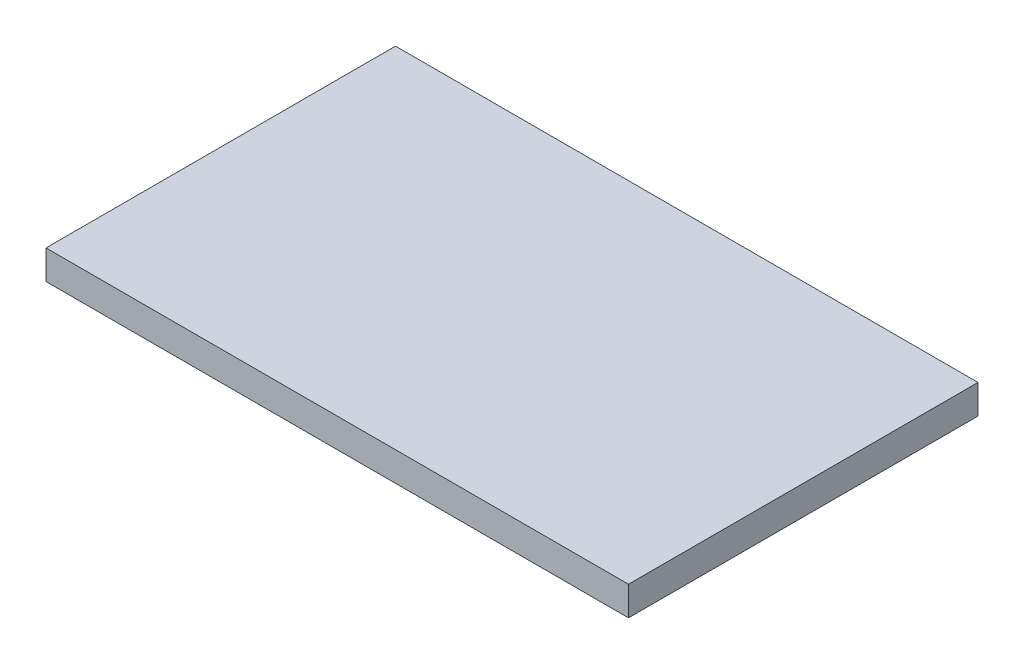
ISO-10303-21;
HEADER;
FILE_DESCRIPTION(('STEP AP214'),'2;1');
FILE_NAME('part.step','',(''),(''),'','','');
FILE_SCHEMA(('AUTOMOTIVE_DESIGN { 1 0 10303 214 1 1 1 1 }'));
ENDSEC;
DATA;
#1=APPLICATION_CONTEXT('core data for automotive mechanical design processes');
#2=APPLICATION_PROTOCOL_DEFINITION('international standard','automotive_design',2000,#1);
#3=PRODUCT_CONTEXT('',#1,'mechanical');
#4=PRODUCT('Part','Part','',(#3));
#5=PRODUCT_RELATED_PRODUCT_CATEGORY('part','',(#4));
#6=PRODUCT_DEFINITION_FORMATION('','',#4);
#7=PRODUCT_DEFINITION_CONTEXT('part definition',#1,'design');
#8=PRODUCT_DEFINITION('design','',#6,#7);
#9=PRODUCT_DEFINITION_SHAPE('','',#8);
#10=(LENGTH_UNIT() NAMED_UNIT(*) SI_UNIT(.MILLI.,.METRE.));
#11=(NAMED_UNIT(*) PLANE_ANGLE_UNIT() SI_UNIT($,.RADIAN.));
#12=(NAMED_UNIT(*) SI_UNIT($,.STERADIAN.) SOLID_ANGLE_UNIT());
#13=UNCERTAINTY_MEASURE_WITH_UNIT(LENGTH_MEASURE(1.E-05),#10,'distance_accuracy_value','');
#14=(GEOMETRIC_REPRESENTATION_CONTEXT(3) GLOBAL_UNCERTAINTY_ASSIGNED_CONTEXT((#13)) GLOBAL_UNIT_ASSIGNED_CONTEXT((#10,
#11,#12)) REPRESENTATION_CONTEXT('',''));
#15=CARTESIAN_POINT('',(0.,0.,0.));
#16=DIRECTION('',(0.,0.,1.));
#17=DIRECTION('',(1.,0.,0.));
#18=AXIS2_PLACEMENT_3D('',#15,#16,#17);
#19=CARTESIAN_POINT('',(0.,5.,0.));
#20=DIRECTION('',(1.,0.,0.));
#21=DIRECTION('',(0.,0.,-1.));
#22=AXIS2_PLACEMENT_3D('',#19,#20,#21);
#23=PLANE('',#22);
#24=DIRECTION('',(0.,0.,1.));
#25=VECTOR('',#24,1.);
#26=CARTESIAN_POINT('',(0.,0.,0.));
#27=LINE('',#26,#25);
#28=CARTESIAN_POINT('',(0.,0.,-60.));
#29=VERTEX_POINT('',#28);
#30=CARTESIAN_POINT('',(0.,0.,0.));
#31=VERTEX_POINT('',#30);
#32=EDGE_CURVE('E107',#29,#31,#27,.T.);
#33=ORIENTED_EDGE('',*,*,#32,.T.);
#34=DIRECTION('',(0.,-1.,0.));
#35=VECTOR('',#34,1.);
#36=CARTESIAN_POINT('',(0.,5.,0.));
#37=LINE('',#36,#35);
#38=CARTESIAN_POINT('',(0.,5.,0.));
#39=VERTEX_POINT('',#38);
#40=EDGE_CURVE('E11',#39,#31,#37,.T.);
#41=ORIENTED_EDGE('',*,*,#40,.F.);
#42=DIRECTION('',(0.,0.,1.));
#43=VECTOR('',#42,1.);
#44=CARTESIAN_POINT('',(0.,5.,0.));
#45=LINE('',#44,#43);
#46=CARTESIAN_POINT('',(0.,5.,-60.));
#47=VERTEX_POINT('',#46);
#48=EDGE_CURVE('E91',#47,#39,#45,.T.);
#49=ORIENTED_EDGE('',*,*,#48,.F.);
#50=DIRECTION('',(0.,-1.,0.));
#51=VECTOR('',#50,1.);
#52=CARTESIAN_POINT('',(0.,5.,-60.));
#53=LINE('',#52,#51);
#54=EDGE_CURVE('E103',#47,#29,#53,.T.);
#55=ORIENTED_EDGE('',*,*,#54,.T.);
#56=EDGE_LOOP('',(#33,#41,#49,#55));
#57=FACE_BOUND('',#56,.T.);
#58=ADVANCED_FACE('F39',(#57),#23,.F.);
#59=CARTESIAN_POINT('',(0.,5.,0.));
#60=DIRECTION('',(0.,0.,-1.));
#61=DIRECTION('',(-1.,0.,0.));
#62=AXIS2_PLACEMENT_3D('',#59,#60,#61);
#63=PLANE('',#62);
#64=DIRECTION('',(1.,0.,0.));
#65=VECTOR('',#64,1.);
#66=CARTESIAN_POINT('',(0.,0.,0.));
#67=LINE('',#66,#65);
#68=CARTESIAN_POINT('',(100.,0.,0.));
#69=VERTEX_POINT('',#68);
#70=EDGE_CURVE('E96',#31,#69,#67,.T.);
#71=ORIENTED_EDGE('',*,*,#70,.T.);
#72=DIRECTION('',(0.,-1.,0.));
#73=VECTOR('',#72,1.);
#74=CARTESIAN_POINT('',(100.,5.,0.));
#75=LINE('',#74,#73);
#76=CARTESIAN_POINT('',(100.,5.,0.));
#77=VERTEX_POINT('',#76);
#78=EDGE_CURVE('E48',#77,#69,#75,.T.);
#79=ORIENTED_EDGE('',*,*,#78,.F.);
#80=DIRECTION('',(1.,0.,0.));
#81=VECTOR('',#80,1.);
#82=CARTESIAN_POINT('',(0.,5.,0.));
#83=LINE('',#82,#81);
#84=EDGE_CURVE('E86',#39,#77,#83,.T.);
#85=ORIENTED_EDGE('',*,*,#84,.F.);
#86=ORIENTED_EDGE('',*,*,#40,.T.);
#87=EDGE_LOOP('',(#71,#79,#85,#86));
#88=FACE_BOUND('',#87,.T.);
#89=ADVANCED_FACE('F95',(#88),#63,.F.);
#90=CARTESIAN_POINT('',(100.,5.,0.));
#91=DIRECTION('',(-1.,0.,0.));
#92=DIRECTION('',(0.,0.,1.));
#93=AXIS2_PLACEMENT_3D('',#90,#91,#92);
#94=PLANE('',#93);
#95=DIRECTION('',(0.,0.,-1.));
#96=VECTOR('',#95,1.);
#97=CARTESIAN_POINT('',(100.,0.,0.));
#98=LINE('',#97,#96);
#99=CARTESIAN_POINT('',(100.,0.,-60.));
#100=VERTEX_POINT('',#99);
#101=EDGE_CURVE('E73',#69,#100,#98,.T.);
#102=ORIENTED_EDGE('',*,*,#101,.T.);
#103=DIRECTION('',(0.,-1.,0.));
#104=VECTOR('',#103,1.);
#105=CARTESIAN_POINT('',(100.,5.,-60.));
#106=LINE('',#105,#104);
#107=CARTESIAN_POINT('',(100.,5.,-60.));
#108=VERTEX_POINT('',#107);
#109=EDGE_CURVE('E98',#108,#100,#106,.T.);
#110=ORIENTED_EDGE('',*,*,#109,.F.);
#111=DIRECTION('',(0.,0.,-1.));
#112=VECTOR('',#111,1.);
#113=CARTESIAN_POINT('',(100.,5.,0.));
#114=LINE('',#113,#112);
#115=EDGE_CURVE('E89',#77,#108,#114,.T.);
#116=ORIENTED_EDGE('',*,*,#115,.F.);
#117=ORIENTED_EDGE('',*,*,#78,.T.);
#118=EDGE_LOOP('',(#102,#110,#116,#117));
#119=FACE_BOUND('',#118,.T.);
#120=ADVANCED_FACE('F99',(#119),#94,.F.);
#121=CARTESIAN_POINT('',(0.,5.,-60.));
#122=DIRECTION('',(0.,0.,1.));
#123=DIRECTION('',(1.,0.,0.));
#124=AXIS2_PLACEMENT_3D('',#121,#122,#123);
#125=PLANE('',#124);
#126=DIRECTION('',(-1.,0.,0.));
#127=VECTOR('',#126,1.);
#128=CARTESIAN_POINT('',(0.,0.,-60.));
#129=LINE('',#128,#127);
#130=EDGE_CURVE('E79',#100,#29,#129,.T.);
#131=ORIENTED_EDGE('',*,*,#130,.T.);
#132=ORIENTED_EDGE('',*,*,#54,.F.);
#133=DIRECTION('',(-1.,0.,0.));
#134=VECTOR('',#133,1.);
#135=CARTESIAN_POINT('',(0.,5.,-60.));
#136=LINE('',#135,#134);
#137=EDGE_CURVE('E56',#108,#47,#136,.T.);
#138=ORIENTED_EDGE('',*,*,#137,.F.);
#139=ORIENTED_EDGE('',*,*,#109,.T.);
#140=EDGE_LOOP('',(#131,#132,#138,#139));
#141=FACE_BOUND('',#140,.T.);
#142=ADVANCED_FACE('F120',(#141),#125,.F.);
#143=CARTESIAN_POINT('',(0.,5.,0.));
#144=DIRECTION('',(0.,-1.,0.));
#145=DIRECTION('',(0.,0.,-1.));
#146=AXIS2_PLACEMENT_3D('',#143,#144,#145);
#147=PLANE('',#146);
#148=ORIENTED_EDGE('',*,*,#48,.T.);
#149=ORIENTED_EDGE('',*,*,#84,.T.);
#150=ORIENTED_EDGE('',*,*,#115,.T.);
#151=ORIENTED_EDGE('',*,*,#137,.T.);
#152=EDGE_LOOP('',(#148,#149,#150,#151));
#153=FACE_BOUND('',#152,.T.);
#154=ADVANCED_FACE('F87',(#153),#147,.F.);
#155=CARTESIAN_POINT('',(0.,0.,0.));
#156=DIRECTION('',(0.,-1.,0.));
#157=DIRECTION('',(0.,0.,-1.));
#158=AXIS2_PLACEMENT_3D('',#155,#156,#157);
#159=PLANE('',#158);
#160=ORIENTED_EDGE('',*,*,#32,.F.);
#161=ORIENTED_EDGE('',*,*,#130,.F.);
#162=ORIENTED_EDGE('',*,*,#101,.F.);
#163=ORIENTED_EDGE('',*,*,#70,.F.);
#164=EDGE_LOOP('',(#160,#161,#162,#163));
#165=FACE_BOUND('',#164,.T.);
#166=ADVANCED_FACE('F123',(#165),#159,.T.);
#167=CLOSED_SHELL('',(#58,#89,#120,#142,#154,#166));
#168=MANIFOLD_SOLID_BREP('B2',#167);
#169=ADVANCED_BREP_SHAPE_REPRESENTATION('',(#18,#168),#14);
#170=SHAPE_DEFINITION_REPRESENTATION(#9,#169);
ENDSEC;
END-ISO-10303-21;
